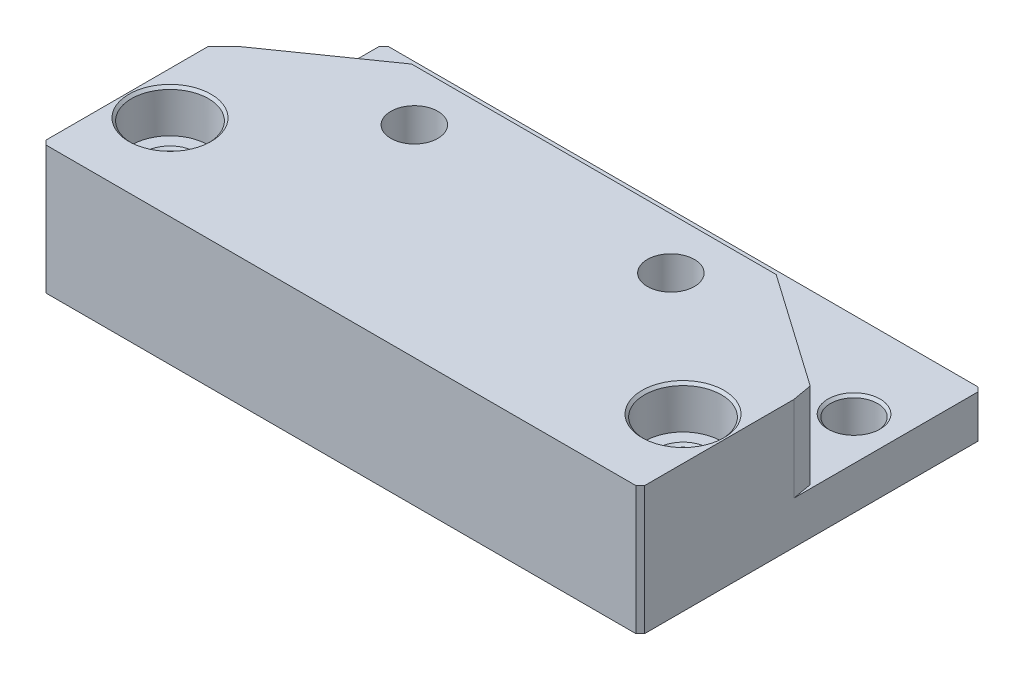
ISO-10303-21;
HEADER;
FILE_DESCRIPTION(('STEP AP214'),'2;1');
FILE_NAME('part.step','',(''),(''),'','','');
FILE_SCHEMA(('AUTOMOTIVE_DESIGN { 1 0 10303 214 1 1 1 1 }'));
ENDSEC;
DATA;
#1=APPLICATION_CONTEXT('core data for automotive mechanical design processes');
#2=APPLICATION_PROTOCOL_DEFINITION('international standard','automotive_design',2000,#1);
#3=PRODUCT_CONTEXT('',#1,'mechanical');
#4=PRODUCT('Part','Part','',(#3));
#5=PRODUCT_RELATED_PRODUCT_CATEGORY('part','',(#4));
#6=PRODUCT_DEFINITION_FORMATION('','',#4);
#7=PRODUCT_DEFINITION_CONTEXT('part definition',#1,'design');
#8=PRODUCT_DEFINITION('design','',#6,#7);
#9=PRODUCT_DEFINITION_SHAPE('','',#8);
#10=(LENGTH_UNIT() NAMED_UNIT(*) SI_UNIT(.MILLI.,.METRE.));
#11=(NAMED_UNIT(*) PLANE_ANGLE_UNIT() SI_UNIT($,.RADIAN.));
#12=(NAMED_UNIT(*) SI_UNIT($,.STERADIAN.) SOLID_ANGLE_UNIT());
#13=UNCERTAINTY_MEASURE_WITH_UNIT(LENGTH_MEASURE(1.E-05),#10,'distance_accuracy_value','');
#14=(GEOMETRIC_REPRESENTATION_CONTEXT(3) GLOBAL_UNCERTAINTY_ASSIGNED_CONTEXT((#13)) GLOBAL_UNIT_ASSIGNED_CONTEXT((#10,
#11,#12)) REPRESENTATION_CONTEXT('',''));
#15=CARTESIAN_POINT('',(0.,0.,0.));
#16=DIRECTION('',(0.,0.,1.));
#17=DIRECTION('',(1.,0.,0.));
#18=AXIS2_PLACEMENT_3D('',#15,#16,#17);
#19=CARTESIAN_POINT('',(15.,-7.5,16.42));
#20=DIRECTION('',(0.,1.,0.));
#21=DIRECTION('',(0.,0.,1.));
#22=AXIS2_PLACEMENT_3D('',#19,#20,#21);
#23=CYLINDRICAL_SURFACE('',#22,2.75);
#24=CARTESIAN_POINT('',(15.,7.5,16.42));
#25=DIRECTION('',(0.,1.,0.));
#26=DIRECTION('',(0.,0.,1.));
#27=AXIS2_PLACEMENT_3D('',#24,#25,#26);
#28=CIRCLE('',#27,2.75);
#29=CARTESIAN_POINT('',(15.,7.5,19.17));
#30=VERTEX_POINT('',#29);
#31=EDGE_CURVE('E204',#30,#30,#28,.T.);
#32=ORIENTED_EDGE('',*,*,#31,.T.);
#33=EDGE_LOOP('',(#32));
#34=FACE_BOUND('',#33,.T.);
#35=CARTESIAN_POINT('',(15.,-2.5,16.42));
#36=DIRECTION('',(0.,-1.,0.));
#37=DIRECTION('',(0.,0.,-1.));
#38=AXIS2_PLACEMENT_3D('',#35,#36,#37);
#39=CIRCLE('',#38,2.75);
#40=CARTESIAN_POINT('',(15.,-2.5,13.67));
#41=VERTEX_POINT('',#40);
#42=EDGE_CURVE('E235',#41,#41,#39,.F.);
#43=ORIENTED_EDGE('',*,*,#42,.F.);
#44=EDGE_LOOP('',(#43));
#45=FACE_BOUND('',#44,.T.);
#46=ADVANCED_FACE('F47',(#34,#45),#23,.F.);
#47=CARTESIAN_POINT('',(-15.,-7.5,16.42));
#48=DIRECTION('',(0.,1.,0.));
#49=DIRECTION('',(0.,0.,1.));
#50=AXIS2_PLACEMENT_3D('',#47,#48,#49);
#51=CYLINDRICAL_SURFACE('',#50,2.75);
#52=CARTESIAN_POINT('',(-15.,7.5,16.42));
#53=DIRECTION('',(0.,1.,0.));
#54=DIRECTION('',(0.,0.,1.));
#55=AXIS2_PLACEMENT_3D('',#52,#53,#54);
#56=CIRCLE('',#55,2.75);
#57=CARTESIAN_POINT('',(-15.,7.5,19.17));
#58=VERTEX_POINT('',#57);
#59=EDGE_CURVE('E205',#58,#58,#56,.T.);
#60=ORIENTED_EDGE('',*,*,#59,.T.);
#61=EDGE_LOOP('',(#60));
#62=FACE_BOUND('',#61,.T.);
#63=CARTESIAN_POINT('',(-15.,-2.5,16.42));
#64=DIRECTION('',(0.,-1.,0.));
#65=DIRECTION('',(0.,0.,-1.));
#66=AXIS2_PLACEMENT_3D('',#63,#64,#65);
#67=CIRCLE('',#66,2.75);
#68=CARTESIAN_POINT('',(-15.,-2.5,13.67));
#69=VERTEX_POINT('',#68);
#70=EDGE_CURVE('E232',#69,#69,#67,.F.);
#71=ORIENTED_EDGE('',*,*,#70,.F.);
#72=EDGE_LOOP('',(#71));
#73=FACE_BOUND('',#72,.T.);
#74=ADVANCED_FACE('F372',(#62,#73),#51,.F.);
#75=CARTESIAN_POINT('',(30.,-7.5,30.));
#76=DIRECTION('',(0.,1.,0.));
#77=DIRECTION('',(0.,0.,1.));
#78=AXIS2_PLACEMENT_3D('',#75,#76,#77);
#79=CYLINDRICAL_SURFACE('',#78,2.75);
#80=CARTESIAN_POINT('',(30.,2.19999999999999,30.));
#81=DIRECTION('',(0.,1.,0.));
#82=DIRECTION('',(0.,0.,1.));
#83=AXIS2_PLACEMENT_3D('',#80,#81,#82);
#84=CIRCLE('',#83,2.75);
#85=CARTESIAN_POINT('',(30.,2.19999999999999,32.75));
#86=VERTEX_POINT('',#85);
#87=EDGE_CURVE('E248',#86,#86,#84,.T.);
#88=ORIENTED_EDGE('',*,*,#87,.T.);
#89=EDGE_LOOP('',(#88));
#90=FACE_BOUND('',#89,.T.);
#91=CARTESIAN_POINT('',(30.,-7.5,30.));
#92=DIRECTION('',(0.,1.,0.));
#93=DIRECTION('',(0.,0.,-1.));
#94=AXIS2_PLACEMENT_3D('',#91,#92,#93);
#95=CIRCLE('',#94,2.75);
#96=CARTESIAN_POINT('',(30.,-7.5,27.25));
#97=VERTEX_POINT('',#96);
#98=EDGE_CURVE('E191',#97,#97,#95,.T.);
#99=ORIENTED_EDGE('',*,*,#98,.F.);
#100=EDGE_LOOP('',(#99));
#101=FACE_BOUND('',#100,.T.);
#102=ADVANCED_FACE('F379',(#90,#101),#79,.F.);
#103=CARTESIAN_POINT('',(-30.,-7.5,30.));
#104=DIRECTION('',(0.,1.,0.));
#105=DIRECTION('',(0.,0.,1.));
#106=AXIS2_PLACEMENT_3D('',#103,#104,#105);
#107=CYLINDRICAL_SURFACE('',#106,2.75);
#108=CARTESIAN_POINT('',(-30.,2.19999999999999,30.));
#109=DIRECTION('',(0.,1.,0.));
#110=DIRECTION('',(0.,0.,1.));
#111=AXIS2_PLACEMENT_3D('',#108,#109,#110);
#112=CIRCLE('',#111,2.75);
#113=CARTESIAN_POINT('',(-30.,2.19999999999999,32.75));
#114=VERTEX_POINT('',#113);
#115=EDGE_CURVE('E242',#114,#114,#112,.T.);
#116=ORIENTED_EDGE('',*,*,#115,.T.);
#117=EDGE_LOOP('',(#116));
#118=FACE_BOUND('',#117,.T.);
#119=CARTESIAN_POINT('',(-30.,-7.5,30.));
#120=DIRECTION('',(0.,1.,0.));
#121=DIRECTION('',(0.,0.,1.));
#122=AXIS2_PLACEMENT_3D('',#119,#120,#121);
#123=CIRCLE('',#122,2.75);
#124=CARTESIAN_POINT('',(-30.,-7.5,32.75));
#125=VERTEX_POINT('',#124);
#126=EDGE_CURVE('E195',#125,#125,#123,.T.);
#127=ORIENTED_EDGE('',*,*,#126,.F.);
#128=EDGE_LOOP('',(#127));
#129=FACE_BOUND('',#128,.T.);
#130=ADVANCED_FACE('F400',(#118,#129),#107,.F.);
#131=CARTESIAN_POINT('',(35.,-7.5,40.));
#132=DIRECTION('',(-1.,0.,0.));
#133=DIRECTION('',(0.,0.,1.));
#134=AXIS2_PLACEMENT_3D('',#131,#132,#133);
#135=PLANE('',#134);
#136=DIRECTION('',(0.,0.,-1.));
#137=VECTOR('',#136,1.);
#138=CARTESIAN_POINT('',(35.,7.5,40.));
#139=LINE('',#138,#137);
#140=CARTESIAN_POINT('',(35.,7.5,39.5));
#141=VERTEX_POINT('',#140);
#142=CARTESIAN_POINT('',(35.,7.5,22.0360328299639));
#143=VERTEX_POINT('',#142);
#144=EDGE_CURVE('E228',#141,#143,#139,.T.);
#145=ORIENTED_EDGE('',*,*,#144,.F.);
#146=DIRECTION('',(0.,-1.,0.));
#147=VECTOR('',#146,1.);
#148=CARTESIAN_POINT('',(35.,-7.5,39.5));
#149=LINE('',#148,#147);
#150=CARTESIAN_POINT('',(35.,-7.5,39.5));
#151=VERTEX_POINT('',#150);
#152=EDGE_CURVE('E295',#141,#151,#149,.T.);
#153=ORIENTED_EDGE('',*,*,#152,.T.);
#154=DIRECTION('',(0.,0.,-1.));
#155=VECTOR('',#154,1.);
#156=CARTESIAN_POINT('',(35.,-7.5,40.));
#157=LINE('',#156,#155);
#158=CARTESIAN_POINT('',(35.,-7.5,0.5));
#159=VERTEX_POINT('',#158);
#160=EDGE_CURVE('E217',#151,#159,#157,.T.);
#161=ORIENTED_EDGE('',*,*,#160,.T.);
#162=DIRECTION('',(0.,1.,0.));
#163=VECTOR('',#162,1.);
#164=CARTESIAN_POINT('',(35.,-2.5,0.5));
#165=LINE('',#164,#163);
#166=CARTESIAN_POINT('',(35.,-2.5,0.5));
#167=VERTEX_POINT('',#166);
#168=EDGE_CURVE('E292',#159,#167,#165,.T.);
#169=ORIENTED_EDGE('',*,*,#168,.T.);
#170=DIRECTION('',(0.,0.,-1.));
#171=VECTOR('',#170,1.);
#172=CARTESIAN_POINT('',(35.,-2.5,20.));
#173=LINE('',#172,#171);
#174=CARTESIAN_POINT('',(35.,-2.5,22.0360328299639));
#175=VERTEX_POINT('',#174);
#176=EDGE_CURVE('E178',#175,#167,#173,.T.);
#177=ORIENTED_EDGE('',*,*,#176,.F.);
#178=DIRECTION('',(0.,1.,0.));
#179=VECTOR('',#178,1.);
#180=CARTESIAN_POINT('',(35.,-7.5,22.0360328299639));
#181=LINE('',#180,#179);
#182=EDGE_CURVE('E289',#175,#143,#181,.T.);
#183=ORIENTED_EDGE('',*,*,#182,.T.);
#184=EDGE_LOOP('',(#145,#153,#161,#169,#177,#183));
#185=FACE_BOUND('',#184,.T.);
#186=ADVANCED_FACE('F343',(#185),#135,.F.);
#187=CARTESIAN_POINT('',(-35.,7.5,40.));
#188=DIRECTION('',(0.,-1.,0.));
#189=DIRECTION('',(0.,0.,-1.));
#190=AXIS2_PLACEMENT_3D('',#187,#188,#189);
#191=PLANE('',#190);
#192=CARTESIAN_POINT('',(30.,7.5,30.));
#193=DIRECTION('',(0.,-1.,0.));
#194=DIRECTION('',(0.,0.,-1.));
#195=AXIS2_PLACEMENT_3D('',#192,#193,#194);
#196=CIRCLE('',#195,4.80000000000001);
#197=CARTESIAN_POINT('',(30.,7.5,25.2));
#198=VERTEX_POINT('',#197);
#199=EDGE_CURVE('E269',#198,#198,#196,.T.);
#200=ORIENTED_EDGE('',*,*,#199,.T.);
#201=EDGE_LOOP('',(#200));
#202=FACE_BOUND('',#201,.T.);
#203=CARTESIAN_POINT('',(-30.,7.5,30.));
#204=DIRECTION('',(0.,-1.,0.));
#205=DIRECTION('',(0.,0.,-1.));
#206=AXIS2_PLACEMENT_3D('',#203,#204,#205);
#207=CIRCLE('',#206,4.80000000000001);
#208=CARTESIAN_POINT('',(-30.,7.5,25.2));
#209=VERTEX_POINT('',#208);
#210=EDGE_CURVE('E266',#209,#209,#207,.T.);
#211=ORIENTED_EDGE('',*,*,#210,.T.);
#212=EDGE_LOOP('',(#211));
#213=FACE_BOUND('',#212,.T.);
#214=ORIENTED_EDGE('',*,*,#59,.F.);
#215=EDGE_LOOP('',(#214));
#216=FACE_BOUND('',#215,.T.);
#217=ORIENTED_EDGE('',*,*,#31,.F.);
#218=EDGE_LOOP('',(#217));
#219=FACE_BOUND('',#218,.T.);
#220=DIRECTION('',(-1.,0.,0.));
#221=VECTOR('',#220,1.);
#222=CARTESIAN_POINT('',(-35.,7.5,40.));
#223=LINE('',#222,#221);
#224=CARTESIAN_POINT('',(34.5,7.5,40.));
#225=VERTEX_POINT('',#224);
#226=CARTESIAN_POINT('',(-34.5,7.5,40.));
#227=VERTEX_POINT('',#226);
#228=EDGE_CURVE('E211',#225,#227,#223,.T.);
#229=ORIENTED_EDGE('',*,*,#228,.F.);
#230=DIRECTION('',(-0.707106781186548,0.,0.707106781186548));
#231=VECTOR('',#230,1.);
#232=CARTESIAN_POINT('',(34.5,7.5,40.));
#233=LINE('',#232,#231);
#234=EDGE_CURVE('E287',#225,#141,#233,.F.);
#235=ORIENTED_EDGE('',*,*,#234,.T.);
#236=ORIENTED_EDGE('',*,*,#144,.T.);
#237=DIRECTION('',(0.173648177666937,0.,0.984807753012207));
#238=VECTOR('',#237,1.);
#239=CARTESIAN_POINT('',(35.,7.5,22.0360328299639));
#240=LINE('',#239,#238);
#241=CARTESIAN_POINT('',(34.5904239778555,7.5,19.7132117818245));
#242=VERTEX_POINT('',#241);
#243=EDGE_CURVE('E281',#143,#242,#240,.F.);
#244=ORIENTED_EDGE('',*,*,#243,.T.);
#245=DIRECTION('',(0.819152044288993,0.,0.573576436351044));
#246=VECTOR('',#245,1.);
#247=CARTESIAN_POINT('',(35.,7.5,20.));
#248=LINE('',#247,#246);
#249=CARTESIAN_POINT('',(21.3183420954105,7.5,10.42));
#250=VERTEX_POINT('',#249);
#251=EDGE_CURVE('E189',#250,#242,#248,.T.);
#252=ORIENTED_EDGE('',*,*,#251,.F.);
#253=DIRECTION('',(1.,0.,0.));
#254=VECTOR('',#253,1.);
#255=CARTESIAN_POINT('',(21.3183420954105,7.5,10.42));
#256=LINE('',#255,#254);
#257=CARTESIAN_POINT('',(-21.3183420954107,7.5,10.42));
#258=VERTEX_POINT('',#257);
#259=EDGE_CURVE('E186',#258,#250,#256,.T.);
#260=ORIENTED_EDGE('',*,*,#259,.F.);
#261=DIRECTION('',(0.819152044288989,0.,-0.57357643635105));
#262=VECTOR('',#261,1.);
#263=CARTESIAN_POINT('',(-35.,7.5,20.));
#264=LINE('',#263,#262);
#265=CARTESIAN_POINT('',(-33.3321795450956,7.5,18.8321795450956));
#266=VERTEX_POINT('',#265);
#267=EDGE_CURVE('E168',#266,#258,#264,.T.);
#268=ORIENTED_EDGE('',*,*,#267,.F.);
#269=DIRECTION('',(0.707106781186548,0.,-0.707106781186548));
#270=VECTOR('',#269,1.);
#271=CARTESIAN_POINT('',(-33.3321795450956,7.5,18.8321795450956));
#272=LINE('',#271,#270);
#273=CARTESIAN_POINT('',(-35.,7.5,20.5));
#274=VERTEX_POINT('',#273);
#275=EDGE_CURVE('E283',#266,#274,#272,.F.);
#276=ORIENTED_EDGE('',*,*,#275,.T.);
#277=DIRECTION('',(0.,0.,-1.));
#278=VECTOR('',#277,1.);
#279=CARTESIAN_POINT('',(-35.,7.5,40.));
#280=LINE('',#279,#278);
#281=CARTESIAN_POINT('',(-35.,7.5,39.5));
#282=VERTEX_POINT('',#281);
#283=EDGE_CURVE('E225',#282,#274,#280,.T.);
#284=ORIENTED_EDGE('',*,*,#283,.F.);
#285=DIRECTION('',(-0.707106781186548,0.,-0.707106781186548));
#286=VECTOR('',#285,1.);
#287=CARTESIAN_POINT('',(-34.5,7.5,40.));
#288=LINE('',#287,#286);
#289=EDGE_CURVE('E285',#282,#227,#288,.F.);
#290=ORIENTED_EDGE('',*,*,#289,.T.);
#291=EDGE_LOOP('',(#229,#235,#236,#244,#252,#260,#268,#276,#284,#290));
#292=FACE_BOUND('',#291,.T.);
#293=ADVANCED_FACE('F359',(#202,#213,#216,#219,#292),#191,.F.);
#294=CARTESIAN_POINT('',(-35.,-7.5,40.));
#295=DIRECTION('',(1.,0.,0.));
#296=DIRECTION('',(0.,0.,-1.));
#297=AXIS2_PLACEMENT_3D('',#294,#295,#296);
#298=PLANE('',#297);
#299=DIRECTION('',(0.,0.,-1.));
#300=VECTOR('',#299,1.);
#301=CARTESIAN_POINT('',(-35.,-7.5,40.));
#302=LINE('',#301,#300);
#303=CARTESIAN_POINT('',(-35.,-7.5,39.5));
#304=VERTEX_POINT('',#303);
#305=CARTESIAN_POINT('',(-35.,-7.5,0.5));
#306=VERTEX_POINT('',#305);
#307=EDGE_CURVE('E222',#304,#306,#302,.T.);
#308=ORIENTED_EDGE('',*,*,#307,.F.);
#309=DIRECTION('',(0.,1.,0.));
#310=VECTOR('',#309,1.);
#311=CARTESIAN_POINT('',(-35.,-7.5,39.5));
#312=LINE('',#311,#310);
#313=EDGE_CURVE('E311',#304,#282,#312,.T.);
#314=ORIENTED_EDGE('',*,*,#313,.T.);
#315=ORIENTED_EDGE('',*,*,#283,.T.);
#316=DIRECTION('',(0.,-1.,0.));
#317=VECTOR('',#316,1.);
#318=CARTESIAN_POINT('',(-35.,-7.5,20.5));
#319=LINE('',#318,#317);
#320=CARTESIAN_POINT('',(-35.,-2.5,20.5));
#321=VERTEX_POINT('',#320);
#322=EDGE_CURVE('E308',#274,#321,#319,.T.);
#323=ORIENTED_EDGE('',*,*,#322,.T.);
#324=DIRECTION('',(0.,0.,1.));
#325=VECTOR('',#324,1.);
#326=CARTESIAN_POINT('',(-35.,-2.5,0.));
#327=LINE('',#326,#325);
#328=CARTESIAN_POINT('',(-35.,-2.5,0.5));
#329=VERTEX_POINT('',#328);
#330=EDGE_CURVE('E162',#329,#321,#327,.T.);
#331=ORIENTED_EDGE('',*,*,#330,.F.);
#332=DIRECTION('',(0.,-1.,0.));
#333=VECTOR('',#332,1.);
#334=CARTESIAN_POINT('',(-35.,-7.5,0.5));
#335=LINE('',#334,#333);
#336=EDGE_CURVE('E305',#329,#306,#335,.T.);
#337=ORIENTED_EDGE('',*,*,#336,.T.);
#338=EDGE_LOOP('',(#308,#314,#315,#323,#331,#337));
#339=FACE_BOUND('',#338,.T.);
#340=ADVANCED_FACE('F328',(#339),#298,.F.);
#341=CARTESIAN_POINT('',(-35.,-7.5,40.));
#342=DIRECTION('',(0.,1.,0.));
#343=DIRECTION('',(0.,0.,1.));
#344=AXIS2_PLACEMENT_3D('',#341,#342,#343);
#345=PLANE('',#344);
#346=CARTESIAN_POINT('',(-15.,-7.5,16.42));
#347=DIRECTION('',(0.,-1.,0.));
#348=DIRECTION('',(0.,0.,-1.));
#349=AXIS2_PLACEMENT_3D('',#346,#347,#348);
#350=CIRCLE('',#349,4.5);
#351=CARTESIAN_POINT('',(-15.,-7.5,11.92));
#352=VERTEX_POINT('',#351);
#353=EDGE_CURVE('E736',#352,#352,#350,.T.);
#354=ORIENTED_EDGE('',*,*,#353,.F.);
#355=EDGE_LOOP('',(#354));
#356=FACE_BOUND('',#355,.T.);
#357=CARTESIAN_POINT('',(15.,-7.5,16.42));
#358=DIRECTION('',(0.,-1.,0.));
#359=DIRECTION('',(0.,0.,-1.));
#360=AXIS2_PLACEMENT_3D('',#357,#358,#359);
#361=CIRCLE('',#360,4.5);
#362=CARTESIAN_POINT('',(15.,-7.5,11.92));
#363=VERTEX_POINT('',#362);
#364=EDGE_CURVE('E734',#363,#363,#361,.T.);
#365=ORIENTED_EDGE('',*,*,#364,.F.);
#366=EDGE_LOOP('',(#365));
#367=FACE_BOUND('',#366,.T.);
#368=CARTESIAN_POINT('',(30.,-7.5,10.));
#369=DIRECTION('',(0.,1.,0.));
#370=DIRECTION('',(0.,0.,-1.));
#371=AXIS2_PLACEMENT_3D('',#368,#369,#370);
#372=CIRCLE('',#371,2.75);
#373=CARTESIAN_POINT('',(30.,-7.5,7.25));
#374=VERTEX_POINT('',#373);
#375=EDGE_CURVE('E196',#374,#374,#372,.T.);
#376=ORIENTED_EDGE('',*,*,#375,.T.);
#377=EDGE_LOOP('',(#376));
#378=FACE_BOUND('',#377,.T.);
#379=ORIENTED_EDGE('',*,*,#126,.T.);
#380=EDGE_LOOP('',(#379));
#381=FACE_BOUND('',#380,.T.);
#382=ORIENTED_EDGE('',*,*,#98,.T.);
#383=EDGE_LOOP('',(#382));
#384=FACE_BOUND('',#383,.T.);
#385=CARTESIAN_POINT('',(-30.,-7.5,10.));
#386=DIRECTION('',(0.,1.,0.));
#387=DIRECTION('',(0.,0.,1.));
#388=AXIS2_PLACEMENT_3D('',#385,#386,#387);
#389=CIRCLE('',#388,2.75);
#390=CARTESIAN_POINT('',(-30.,-7.5,12.75));
#391=VERTEX_POINT('',#390);
#392=EDGE_CURVE('E199',#391,#391,#389,.T.);
#393=ORIENTED_EDGE('',*,*,#392,.T.);
#394=EDGE_LOOP('',(#393));
#395=FACE_BOUND('',#394,.T.);
#396=ORIENTED_EDGE('',*,*,#160,.F.);
#397=DIRECTION('',(0.707106781186548,0.,-0.707106781186548));
#398=VECTOR('',#397,1.);
#399=CARTESIAN_POINT('',(34.5,-7.5,40.));
#400=LINE('',#399,#398);
#401=CARTESIAN_POINT('',(34.5,-7.5,40.));
#402=VERTEX_POINT('',#401);
#403=EDGE_CURVE('E303',#151,#402,#400,.F.);
#404=ORIENTED_EDGE('',*,*,#403,.T.);
#405=DIRECTION('',(1.,0.,0.));
#406=VECTOR('',#405,1.);
#407=CARTESIAN_POINT('',(-35.,-7.5,40.));
#408=LINE('',#407,#406);
#409=CARTESIAN_POINT('',(-34.5,-7.5,40.));
#410=VERTEX_POINT('',#409);
#411=EDGE_CURVE('E214',#410,#402,#408,.T.);
#412=ORIENTED_EDGE('',*,*,#411,.F.);
#413=DIRECTION('',(0.707106781186548,0.,0.707106781186548));
#414=VECTOR('',#413,1.);
#415=CARTESIAN_POINT('',(-34.5,-7.5,40.));
#416=LINE('',#415,#414);
#417=EDGE_CURVE('E301',#410,#304,#416,.F.);
#418=ORIENTED_EDGE('',*,*,#417,.T.);
#419=ORIENTED_EDGE('',*,*,#307,.T.);
#420=DIRECTION('',(0.707106781186548,0.,-0.707106781186548));
#421=VECTOR('',#420,1.);
#422=CARTESIAN_POINT('',(-35.,-7.5,0.5));
#423=LINE('',#422,#421);
#424=CARTESIAN_POINT('',(-34.5,-7.5,0.));
#425=VERTEX_POINT('',#424);
#426=EDGE_CURVE('E299',#306,#425,#423,.T.);
#427=ORIENTED_EDGE('',*,*,#426,.T.);
#428=DIRECTION('',(1.,0.,0.));
#429=VECTOR('',#428,1.);
#430=CARTESIAN_POINT('',(-35.,-7.5,0.));
#431=LINE('',#430,#429);
#432=CARTESIAN_POINT('',(34.5,-7.5,0.));
#433=VERTEX_POINT('',#432);
#434=EDGE_CURVE('E208',#425,#433,#431,.T.);
#435=ORIENTED_EDGE('',*,*,#434,.T.);
#436=DIRECTION('',(0.707106781186548,0.,0.707106781186548));
#437=VECTOR('',#436,1.);
#438=CARTESIAN_POINT('',(35.,-7.5,0.5));
#439=LINE('',#438,#437);
#440=EDGE_CURVE('E297',#433,#159,#439,.T.);
#441=ORIENTED_EDGE('',*,*,#440,.T.);
#442=EDGE_LOOP('',(#396,#404,#412,#418,#419,#427,#435,#441));
#443=FACE_BOUND('',#442,.T.);
#444=ADVANCED_FACE('F333',(#356,#367,#378,#381,#384,#395,#443),#345,.F.);
#445=CARTESIAN_POINT('',(0.,0.,40.));
#446=DIRECTION('',(0.,0.,-1.));
#447=DIRECTION('',(-1.,0.,0.));
#448=AXIS2_PLACEMENT_3D('',#445,#446,#447);
#449=PLANE('',#448);
#450=ORIENTED_EDGE('',*,*,#411,.T.);
#451=DIRECTION('',(0.,1.,0.));
#452=VECTOR('',#451,1.);
#453=CARTESIAN_POINT('',(34.5,0.,40.));
#454=LINE('',#453,#452);
#455=EDGE_CURVE('E278',#402,#225,#454,.T.);
#456=ORIENTED_EDGE('',*,*,#455,.T.);
#457=ORIENTED_EDGE('',*,*,#228,.T.);
#458=DIRECTION('',(0.,-1.,0.));
#459=VECTOR('',#458,1.);
#460=CARTESIAN_POINT('',(-34.5,0.,40.));
#461=LINE('',#460,#459);
#462=EDGE_CURVE('E275',#227,#410,#461,.T.);
#463=ORIENTED_EDGE('',*,*,#462,.T.);
#464=EDGE_LOOP('',(#450,#456,#457,#463));
#465=FACE_BOUND('',#464,.T.);
#466=ADVANCED_FACE('F350',(#465),#449,.F.);
#467=CARTESIAN_POINT('',(0.,0.,0.));
#468=DIRECTION('',(0.,0.,-1.));
#469=DIRECTION('',(-1.,0.,0.));
#470=AXIS2_PLACEMENT_3D('',#467,#468,#469);
#471=PLANE('',#470);
#472=ORIENTED_EDGE('',*,*,#434,.F.);
#473=DIRECTION('',(0.,1.,0.));
#474=VECTOR('',#473,1.);
#475=CARTESIAN_POINT('',(-34.5,-2.5,0.));
#476=LINE('',#475,#474);
#477=CARTESIAN_POINT('',(-34.5,-2.5,0.));
#478=VERTEX_POINT('',#477);
#479=EDGE_CURVE('E71',#425,#478,#476,.T.);
#480=ORIENTED_EDGE('',*,*,#479,.T.);
#481=DIRECTION('',(-1.,0.,0.));
#482=VECTOR('',#481,1.);
#483=CARTESIAN_POINT('',(-35.,-2.5,0.));
#484=LINE('',#483,#482);
#485=CARTESIAN_POINT('',(34.5,-2.5,0.));
#486=VERTEX_POINT('',#485);
#487=EDGE_CURVE('E173',#486,#478,#484,.T.);
#488=ORIENTED_EDGE('',*,*,#487,.F.);
#489=DIRECTION('',(0.,-1.,0.));
#490=VECTOR('',#489,1.);
#491=CARTESIAN_POINT('',(34.5,-7.5,0.));
#492=LINE('',#491,#490);
#493=EDGE_CURVE('E315',#486,#433,#492,.T.);
#494=ORIENTED_EDGE('',*,*,#493,.T.);
#495=EDGE_LOOP('',(#472,#480,#488,#494));
#496=FACE_BOUND('',#495,.T.);
#497=ADVANCED_FACE('F335',(#496),#471,.T.);
#498=CARTESIAN_POINT('',(-30.,-7.5,10.));
#499=DIRECTION('',(0.,1.,0.));
#500=DIRECTION('',(0.,0.,1.));
#501=AXIS2_PLACEMENT_3D('',#498,#499,#500);
#502=CYLINDRICAL_SURFACE('',#501,2.75);
#503=CARTESIAN_POINT('',(-30.,-2.79999999999999,10.));
#504=DIRECTION('',(0.,-1.,0.));
#505=DIRECTION('',(0.,0.,-1.));
#506=AXIS2_PLACEMENT_3D('',#503,#504,#505);
#507=CIRCLE('',#506,2.75);
#508=CARTESIAN_POINT('',(-30.,-2.79999999999999,7.25));
#509=VERTEX_POINT('',#508);
#510=EDGE_CURVE('E260',#509,#509,#507,.F.);
#511=ORIENTED_EDGE('',*,*,#510,.T.);
#512=EDGE_LOOP('',(#511));
#513=FACE_BOUND('',#512,.T.);
#514=ORIENTED_EDGE('',*,*,#392,.F.);
#515=EDGE_LOOP('',(#514));
#516=FACE_BOUND('',#515,.T.);
#517=ADVANCED_FACE('F389',(#513,#516),#502,.F.);
#518=CARTESIAN_POINT('',(30.,-7.5,10.));
#519=DIRECTION('',(0.,1.,0.));
#520=DIRECTION('',(0.,0.,1.));
#521=AXIS2_PLACEMENT_3D('',#518,#519,#520);
#522=CYLINDRICAL_SURFACE('',#521,2.75);
#523=CARTESIAN_POINT('',(30.,-2.79999999999999,10.));
#524=DIRECTION('',(0.,-1.,0.));
#525=DIRECTION('',(0.,0.,-1.));
#526=AXIS2_PLACEMENT_3D('',#523,#524,#525);
#527=CIRCLE('',#526,2.75);
#528=CARTESIAN_POINT('',(30.,-2.79999999999999,7.25));
#529=VERTEX_POINT('',#528);
#530=EDGE_CURVE('E251',#529,#529,#527,.F.);
#531=ORIENTED_EDGE('',*,*,#530,.T.);
#532=EDGE_LOOP('',(#531));
#533=FACE_BOUND('',#532,.T.);
#534=ORIENTED_EDGE('',*,*,#375,.F.);
#535=EDGE_LOOP('',(#534));
#536=FACE_BOUND('',#535,.T.);
#537=ADVANCED_FACE('F479',(#533,#536),#522,.F.);
#538=CARTESIAN_POINT('',(0.,-2.5,0.));
#539=DIRECTION('',(0.,-1.,0.));
#540=DIRECTION('',(0.,0.,-1.));
#541=AXIS2_PLACEMENT_3D('',#538,#539,#540);
#542=PLANE('',#541);
#543=CARTESIAN_POINT('',(30.,-2.5,10.));
#544=DIRECTION('',(0.,-1.,0.));
#545=DIRECTION('',(0.,0.,-1.));
#546=AXIS2_PLACEMENT_3D('',#543,#544,#545);
#547=CIRCLE('',#546,3.04999999999998);
#548=CARTESIAN_POINT('',(30.,-2.5,6.95000000000002));
#549=VERTEX_POINT('',#548);
#550=EDGE_CURVE('E257',#549,#549,#547,.T.);
#551=ORIENTED_EDGE('',*,*,#550,.T.);
#552=EDGE_LOOP('',(#551));
#553=FACE_BOUND('',#552,.T.);
#554=CARTESIAN_POINT('',(-30.,-2.5,10.));
#555=DIRECTION('',(0.,-1.,0.));
#556=DIRECTION('',(0.,0.,-1.));
#557=AXIS2_PLACEMENT_3D('',#554,#555,#556);
#558=CIRCLE('',#557,3.04999999999998);
#559=CARTESIAN_POINT('',(-30.,-2.5,6.95000000000002));
#560=VERTEX_POINT('',#559);
#561=EDGE_CURVE('E254',#560,#560,#558,.T.);
#562=ORIENTED_EDGE('',*,*,#561,.T.);
#563=EDGE_LOOP('',(#562));
#564=FACE_BOUND('',#563,.T.);
#565=ORIENTED_EDGE('',*,*,#487,.T.);
#566=DIRECTION('',(-0.707106781186548,0.,0.707106781186548));
#567=VECTOR('',#566,1.);
#568=CARTESIAN_POINT('',(-35.,-2.5,0.5));
#569=LINE('',#568,#567);
#570=EDGE_CURVE('E320',#478,#329,#569,.T.);
#571=ORIENTED_EDGE('',*,*,#570,.T.);
#572=ORIENTED_EDGE('',*,*,#330,.T.);
#573=DIRECTION('',(-0.707106781186548,0.,0.707106781186548));
#574=VECTOR('',#573,1.);
#575=CARTESIAN_POINT('',(-7.25000000000001,-2.5,-7.25000000000001));
#576=LINE('',#575,#574);
#577=CARTESIAN_POINT('',(-33.3321795450956,-2.5,18.8321795450956));
#578=VERTEX_POINT('',#577);
#579=EDGE_CURVE('E56',#321,#578,#576,.F.);
#580=ORIENTED_EDGE('',*,*,#579,.T.);
#581=DIRECTION('',(0.819152044288989,0.,-0.57357643635105));
#582=VECTOR('',#581,1.);
#583=CARTESIAN_POINT('',(-35.,-2.5,20.));
#584=LINE('',#583,#582);
#585=CARTESIAN_POINT('',(-21.3183420954107,-2.5,10.42));
#586=VERTEX_POINT('',#585);
#587=EDGE_CURVE('E153',#578,#586,#584,.T.);
#588=ORIENTED_EDGE('',*,*,#587,.T.);
#589=DIRECTION('',(1.,0.,0.));
#590=VECTOR('',#589,1.);
#591=CARTESIAN_POINT('',(21.3183420954105,-2.5,10.42));
#592=LINE('',#591,#590);
#593=CARTESIAN_POINT('',(21.3183420954105,-2.5,10.42));
#594=VERTEX_POINT('',#593);
#595=EDGE_CURVE('E157',#586,#594,#592,.T.);
#596=ORIENTED_EDGE('',*,*,#595,.T.);
#597=DIRECTION('',(0.819152044288993,0.,0.573576436351044));
#598=VECTOR('',#597,1.);
#599=CARTESIAN_POINT('',(35.,-2.5,20.));
#600=LINE('',#599,#598);
#601=CARTESIAN_POINT('',(34.5904239778555,-2.5,19.7132117818245));
#602=VERTEX_POINT('',#601);
#603=EDGE_CURVE('E176',#594,#602,#600,.T.);
#604=ORIENTED_EDGE('',*,*,#603,.T.);
#605=DIRECTION('',(-0.173648177666937,0.,-0.984807753012207));
#606=VECTOR('',#605,1.);
#607=CARTESIAN_POINT('',(30.1762373103365,-2.5,-5.32088481407396));
#608=LINE('',#607,#606);
#609=EDGE_CURVE('E11',#602,#175,#608,.F.);
#610=ORIENTED_EDGE('',*,*,#609,.T.);
#611=ORIENTED_EDGE('',*,*,#176,.T.);
#612=DIRECTION('',(-0.707106781186548,0.,-0.707106781186548));
#613=VECTOR('',#612,1.);
#614=CARTESIAN_POINT('',(35.,-2.5,0.5));
#615=LINE('',#614,#613);
#616=EDGE_CURVE('E318',#167,#486,#615,.T.);
#617=ORIENTED_EDGE('',*,*,#616,.T.);
#618=EDGE_LOOP('',(#565,#571,#572,#580,#588,#596,#604,#610,#611,#617));
#619=FACE_BOUND('',#618,.T.);
#620=ADVANCED_FACE('F155',(#553,#564,#619),#542,.F.);
#621=CARTESIAN_POINT('',(35.,-2.5,20.));
#622=DIRECTION('',(-0.573576436351044,0.,0.819152044288993));
#623=DIRECTION('',(0.819152044288994,0.,0.573576436351044));
#624=AXIS2_PLACEMENT_3D('',#621,#622,#623);
#625=PLANE('',#624);
#626=ORIENTED_EDGE('',*,*,#251,.T.);
#627=DIRECTION('',(0.,-1.,0.));
#628=VECTOR('',#627,1.);
#629=CARTESIAN_POINT('',(34.5904239778555,-2.5,19.7132117818245));
#630=LINE('',#629,#628);
#631=EDGE_CURVE('E63',#242,#602,#630,.T.);
#632=ORIENTED_EDGE('',*,*,#631,.T.);
#633=ORIENTED_EDGE('',*,*,#603,.F.);
#634=DIRECTION('',(0.,1.,0.));
#635=VECTOR('',#634,1.);
#636=CARTESIAN_POINT('',(21.3183420954105,-2.5,10.42));
#637=LINE('',#636,#635);
#638=EDGE_CURVE('E172',#594,#250,#637,.T.);
#639=ORIENTED_EDGE('',*,*,#638,.T.);
#640=EDGE_LOOP('',(#626,#632,#633,#639));
#641=FACE_BOUND('',#640,.T.);
#642=ADVANCED_FACE('F470',(#641),#625,.F.);
#643=CARTESIAN_POINT('',(21.3183420954105,-2.5,10.42));
#644=DIRECTION('',(0.,0.,1.));
#645=DIRECTION('',(1.,0.,0.));
#646=AXIS2_PLACEMENT_3D('',#643,#644,#645);
#647=PLANE('',#646);
#648=ORIENTED_EDGE('',*,*,#259,.T.);
#649=ORIENTED_EDGE('',*,*,#638,.F.);
#650=ORIENTED_EDGE('',*,*,#595,.F.);
#651=DIRECTION('',(0.,1.,0.));
#652=VECTOR('',#651,1.);
#653=CARTESIAN_POINT('',(-21.3183420954107,-2.5,10.42));
#654=LINE('',#653,#652);
#655=EDGE_CURVE('E165',#586,#258,#654,.T.);
#656=ORIENTED_EDGE('',*,*,#655,.T.);
#657=EDGE_LOOP('',(#648,#649,#650,#656));
#658=FACE_BOUND('',#657,.T.);
#659=ADVANCED_FACE('F175',(#658),#647,.F.);
#660=CARTESIAN_POINT('',(-35.,-2.5,20.));
#661=DIRECTION('',(0.57357643635105,0.,0.819152044288989));
#662=DIRECTION('',(0.819152044288989,0.,-0.57357643635105));
#663=AXIS2_PLACEMENT_3D('',#660,#661,#662);
#664=PLANE('',#663);
#665=ORIENTED_EDGE('',*,*,#587,.F.);
#666=DIRECTION('',(0.,1.,0.));
#667=VECTOR('',#666,1.);
#668=CARTESIAN_POINT('',(-33.3321795450956,-2.5,18.8321795450956));
#669=LINE('',#668,#667);
#670=EDGE_CURVE('E313',#578,#266,#669,.T.);
#671=ORIENTED_EDGE('',*,*,#670,.T.);
#672=ORIENTED_EDGE('',*,*,#267,.T.);
#673=ORIENTED_EDGE('',*,*,#655,.F.);
#674=EDGE_LOOP('',(#665,#671,#672,#673));
#675=FACE_BOUND('',#674,.T.);
#676=ADVANCED_FACE('F166',(#675),#664,.F.);
#677=CARTESIAN_POINT('',(-30.,2.5,30.));
#678=DIRECTION('',(0.,1.,0.));
#679=DIRECTION('',(0.,0.,1.));
#680=AXIS2_PLACEMENT_3D('',#677,#678,#679);
#681=PLANE('',#680);
#682=CARTESIAN_POINT('',(-30.,2.5,30.));
#683=DIRECTION('',(0.,1.,0.));
#684=DIRECTION('',(0.,0.,1.));
#685=AXIS2_PLACEMENT_3D('',#682,#683,#684);
#686=CIRCLE('',#685,3.05);
#687=CARTESIAN_POINT('',(-30.,2.5,33.05));
#688=VERTEX_POINT('',#687);
#689=EDGE_CURVE('E231',#688,#688,#686,.F.);
#690=ORIENTED_EDGE('',*,*,#689,.T.);
#691=EDGE_LOOP('',(#690));
#692=FACE_BOUND('',#691,.T.);
#693=CARTESIAN_POINT('',(-30.,2.5,30.));
#694=DIRECTION('',(0.,1.,0.));
#695=DIRECTION('',(0.,0.,1.));
#696=AXIS2_PLACEMENT_3D('',#693,#694,#695);
#697=CIRCLE('',#696,4.5);
#698=CARTESIAN_POINT('',(-30.,2.5,34.5));
#699=VERTEX_POINT('',#698);
#700=EDGE_CURVE('E187',#699,#699,#697,.T.);
#701=ORIENTED_EDGE('',*,*,#700,.T.);
#702=EDGE_LOOP('',(#701));
#703=FACE_BOUND('',#702,.T.);
#704=ADVANCED_FACE('F485',(#692,#703),#681,.T.);
#705=CARTESIAN_POINT('',(-30.,2.5,30.));
#706=DIRECTION('',(0.,1.,0.));
#707=DIRECTION('',(0.,0.,1.));
#708=AXIS2_PLACEMENT_3D('',#705,#706,#707);
#709=CYLINDRICAL_SURFACE('',#708,4.5);
#710=CARTESIAN_POINT('',(-30.,7.2,30.));
#711=DIRECTION('',(0.,-1.,0.));
#712=DIRECTION('',(0.,0.,-1.));
#713=AXIS2_PLACEMENT_3D('',#710,#711,#712);
#714=CIRCLE('',#713,4.5);
#715=CARTESIAN_POINT('',(-30.,7.2,25.5));
#716=VERTEX_POINT('',#715);
#717=EDGE_CURVE('E272',#716,#716,#714,.F.);
#718=ORIENTED_EDGE('',*,*,#717,.T.);
#719=EDGE_LOOP('',(#718));
#720=FACE_BOUND('',#719,.T.);
#721=ORIENTED_EDGE('',*,*,#700,.F.);
#722=EDGE_LOOP('',(#721));
#723=FACE_BOUND('',#722,.T.);
#724=ADVANCED_FACE('F519',(#720,#723),#709,.F.);
#725=CARTESIAN_POINT('',(30.,2.5,30.));
#726=DIRECTION('',(0.,1.,0.));
#727=DIRECTION('',(0.,0.,1.));
#728=AXIS2_PLACEMENT_3D('',#725,#726,#727);
#729=PLANE('',#728);
#730=CARTESIAN_POINT('',(30.,2.5,30.));
#731=DIRECTION('',(0.,1.,0.));
#732=DIRECTION('',(0.,0.,1.));
#733=AXIS2_PLACEMENT_3D('',#730,#731,#732);
#734=CIRCLE('',#733,3.05);
#735=CARTESIAN_POINT('',(30.,2.5,33.05));
#736=VERTEX_POINT('',#735);
#737=EDGE_CURVE('E245',#736,#736,#734,.F.);
#738=ORIENTED_EDGE('',*,*,#737,.T.);
#739=EDGE_LOOP('',(#738));
#740=FACE_BOUND('',#739,.T.);
#741=CARTESIAN_POINT('',(30.,2.5,30.));
#742=DIRECTION('',(0.,1.,0.));
#743=DIRECTION('',(0.,0.,1.));
#744=AXIS2_PLACEMENT_3D('',#741,#742,#743);
#745=CIRCLE('',#744,4.5);
#746=CARTESIAN_POINT('',(30.,2.5,34.5));
#747=VERTEX_POINT('',#746);
#748=EDGE_CURVE('E239',#747,#747,#745,.T.);
#749=ORIENTED_EDGE('',*,*,#748,.T.);
#750=EDGE_LOOP('',(#749));
#751=FACE_BOUND('',#750,.T.);
#752=ADVANCED_FACE('F527',(#740,#751),#729,.T.);
#753=CARTESIAN_POINT('',(30.,2.5,30.));
#754=DIRECTION('',(0.,1.,0.));
#755=DIRECTION('',(0.,0.,1.));
#756=AXIS2_PLACEMENT_3D('',#753,#754,#755);
#757=CYLINDRICAL_SURFACE('',#756,4.5);
#758=CARTESIAN_POINT('',(30.,7.2,30.));
#759=DIRECTION('',(0.,-1.,0.));
#760=DIRECTION('',(0.,0.,-1.));
#761=AXIS2_PLACEMENT_3D('',#758,#759,#760);
#762=CIRCLE('',#761,4.5);
#763=CARTESIAN_POINT('',(30.,7.2,25.5));
#764=VERTEX_POINT('',#763);
#765=EDGE_CURVE('E263',#764,#764,#762,.F.);
#766=ORIENTED_EDGE('',*,*,#765,.T.);
#767=EDGE_LOOP('',(#766));
#768=FACE_BOUND('',#767,.T.);
#769=ORIENTED_EDGE('',*,*,#748,.F.);
#770=EDGE_LOOP('',(#769));
#771=FACE_BOUND('',#770,.T.);
#772=ADVANCED_FACE('F530',(#768,#771),#757,.F.);
#773=CARTESIAN_POINT('',(-15.,-2.5,16.42));
#774=DIRECTION('',(0.,-1.,0.));
#775=DIRECTION('',(0.,0.,-1.));
#776=AXIS2_PLACEMENT_3D('',#773,#774,#775);
#777=PLANE('',#776);
#778=CARTESIAN_POINT('',(-15.,-2.5,16.42));
#779=DIRECTION('',(0.,-1.,0.));
#780=DIRECTION('',(0.,0.,-1.));
#781=AXIS2_PLACEMENT_3D('',#778,#779,#780);
#782=CIRCLE('',#781,4.5);
#783=CARTESIAN_POINT('',(-15.,-2.5,11.92));
#784=VERTEX_POINT('',#783);
#785=EDGE_CURVE('E236',#784,#784,#782,.T.);
#786=ORIENTED_EDGE('',*,*,#785,.T.);
#787=EDGE_LOOP('',(#786));
#788=FACE_BOUND('',#787,.T.);
#789=ORIENTED_EDGE('',*,*,#70,.T.);
#790=EDGE_LOOP('',(#789));
#791=FACE_BOUND('',#790,.T.);
#792=ADVANCED_FACE('F567',(#788,#791),#777,.T.);
#793=CARTESIAN_POINT('',(-15.,-2.5,16.42));
#794=DIRECTION('',(0.,-1.,0.));
#795=DIRECTION('',(0.,0.,-1.));
#796=AXIS2_PLACEMENT_3D('',#793,#794,#795);
#797=CYLINDRICAL_SURFACE('',#796,4.5);
#798=ORIENTED_EDGE('',*,*,#785,.F.);
#799=EDGE_LOOP('',(#798));
#800=FACE_BOUND('',#799,.T.);
#801=ORIENTED_EDGE('',*,*,#353,.T.);
#802=EDGE_LOOP('',(#801));
#803=FACE_BOUND('',#802,.T.);
#804=ADVANCED_FACE('F662',(#800,#803),#797,.F.);
#805=CARTESIAN_POINT('',(15.,-2.5,16.42));
#806=DIRECTION('',(0.,-1.,0.));
#807=DIRECTION('',(0.,0.,-1.));
#808=AXIS2_PLACEMENT_3D('',#805,#806,#807);
#809=PLANE('',#808);
#810=CARTESIAN_POINT('',(15.,-2.5,16.42));
#811=DIRECTION('',(0.,-1.,0.));
#812=DIRECTION('',(0.,0.,-1.));
#813=AXIS2_PLACEMENT_3D('',#810,#811,#812);
#814=CIRCLE('',#813,4.5);
#815=CARTESIAN_POINT('',(15.,-2.5,11.92));
#816=VERTEX_POINT('',#815);
#817=EDGE_CURVE('E731',#816,#816,#814,.T.);
#818=ORIENTED_EDGE('',*,*,#817,.T.);
#819=EDGE_LOOP('',(#818));
#820=FACE_BOUND('',#819,.T.);
#821=ORIENTED_EDGE('',*,*,#42,.T.);
#822=EDGE_LOOP('',(#821));
#823=FACE_BOUND('',#822,.T.);
#824=ADVANCED_FACE('F671',(#820,#823),#809,.T.);
#825=CARTESIAN_POINT('',(15.,-2.5,16.42));
#826=DIRECTION('',(0.,-1.,0.));
#827=DIRECTION('',(0.,0.,-1.));
#828=AXIS2_PLACEMENT_3D('',#825,#826,#827);
#829=CYLINDRICAL_SURFACE('',#828,4.5);
#830=ORIENTED_EDGE('',*,*,#817,.F.);
#831=EDGE_LOOP('',(#830));
#832=FACE_BOUND('',#831,.T.);
#833=ORIENTED_EDGE('',*,*,#364,.T.);
#834=EDGE_LOOP('',(#833));
#835=FACE_BOUND('',#834,.T.);
#836=ADVANCED_FACE('F409',(#832,#835),#829,.F.);
#837=CARTESIAN_POINT('',(-30.,2.5,30.));
#838=DIRECTION('',(0.,1.,0.));
#839=DIRECTION('',(0.,0.,1.));
#840=AXIS2_PLACEMENT_3D('',#837,#838,#839);
#841=CONICAL_SURFACE('',#840,3.05,0.785398163397445);
#842=ORIENTED_EDGE('',*,*,#115,.F.);
#843=EDGE_LOOP('',(#842));
#844=FACE_BOUND('',#843,.T.);
#845=ORIENTED_EDGE('',*,*,#689,.F.);
#846=EDGE_LOOP('',(#845));
#847=FACE_BOUND('',#846,.T.);
#848=ADVANCED_FACE('F402',(#844,#847),#841,.F.);
#849=CARTESIAN_POINT('',(30.,2.5,30.));
#850=DIRECTION('',(0.,1.,0.));
#851=DIRECTION('',(0.,0.,1.));
#852=AXIS2_PLACEMENT_3D('',#849,#850,#851);
#853=CONICAL_SURFACE('',#852,3.05,0.785398163397445);
#854=ORIENTED_EDGE('',*,*,#87,.F.);
#855=EDGE_LOOP('',(#854));
#856=FACE_BOUND('',#855,.T.);
#857=ORIENTED_EDGE('',*,*,#737,.F.);
#858=EDGE_LOOP('',(#857));
#859=FACE_BOUND('',#858,.T.);
#860=ADVANCED_FACE('F408',(#856,#859),#853,.F.);
#861=CARTESIAN_POINT('',(30.,-2.79999999999999,10.));
#862=DIRECTION('',(0.,1.,0.));
#863=DIRECTION('',(0.,0.,1.));
#864=AXIS2_PLACEMENT_3D('',#861,#862,#863);
#865=CONICAL_SURFACE('',#864,2.75,0.785398163397435);
#866=ORIENTED_EDGE('',*,*,#550,.F.);
#867=EDGE_LOOP('',(#866));
#868=FACE_BOUND('',#867,.T.);
#869=ORIENTED_EDGE('',*,*,#530,.F.);
#870=EDGE_LOOP('',(#869));
#871=FACE_BOUND('',#870,.T.);
#872=ADVANCED_FACE('F416',(#868,#871),#865,.F.);
#873=CARTESIAN_POINT('',(-30.,-2.79999999999999,10.));
#874=DIRECTION('',(0.,1.,0.));
#875=DIRECTION('',(0.,0.,1.));
#876=AXIS2_PLACEMENT_3D('',#873,#874,#875);
#877=CONICAL_SURFACE('',#876,2.75,0.785398163397435);
#878=ORIENTED_EDGE('',*,*,#561,.F.);
#879=EDGE_LOOP('',(#878));
#880=FACE_BOUND('',#879,.T.);
#881=ORIENTED_EDGE('',*,*,#510,.F.);
#882=EDGE_LOOP('',(#881));
#883=FACE_BOUND('',#882,.T.);
#884=ADVANCED_FACE('F423',(#880,#883),#877,.F.);
#885=CARTESIAN_POINT('',(30.,7.2,30.));
#886=DIRECTION('',(0.,1.,0.));
#887=DIRECTION('',(0.,0.,1.));
#888=AXIS2_PLACEMENT_3D('',#885,#886,#887);
#889=CONICAL_SURFACE('',#888,4.5,0.785398163397455);
#890=ORIENTED_EDGE('',*,*,#199,.F.);
#891=EDGE_LOOP('',(#890));
#892=FACE_BOUND('',#891,.T.);
#893=ORIENTED_EDGE('',*,*,#765,.F.);
#894=EDGE_LOOP('',(#893));
#895=FACE_BOUND('',#894,.T.);
#896=ADVANCED_FACE('F430',(#892,#895),#889,.F.);
#897=CARTESIAN_POINT('',(-30.,7.2,30.));
#898=DIRECTION('',(0.,1.,0.));
#899=DIRECTION('',(0.,0.,1.));
#900=AXIS2_PLACEMENT_3D('',#897,#898,#899);
#901=CONICAL_SURFACE('',#900,4.5,0.785398163397455);
#902=ORIENTED_EDGE('',*,*,#210,.F.);
#903=EDGE_LOOP('',(#902));
#904=FACE_BOUND('',#903,.T.);
#905=ORIENTED_EDGE('',*,*,#717,.F.);
#906=EDGE_LOOP('',(#905));
#907=FACE_BOUND('',#906,.T.);
#908=ADVANCED_FACE('F437',(#904,#907),#901,.F.);
#909=CARTESIAN_POINT('',(34.5,0.,40.));
#910=DIRECTION('',(-0.707106781186547,0.,-0.707106781186547));
#911=DIRECTION('',(0.,1.,0.));
#912=AXIS2_PLACEMENT_3D('',#909,#910,#911);
#913=PLANE('',#912);
#914=ORIENTED_EDGE('',*,*,#403,.F.);
#915=ORIENTED_EDGE('',*,*,#152,.F.);
#916=ORIENTED_EDGE('',*,*,#234,.F.);
#917=ORIENTED_EDGE('',*,*,#455,.F.);
#918=EDGE_LOOP('',(#914,#915,#916,#917));
#919=FACE_BOUND('',#918,.T.);
#920=ADVANCED_FACE('F346',(#919),#913,.F.);
#921=CARTESIAN_POINT('',(-34.5,0.,40.));
#922=DIRECTION('',(0.707106781186547,0.,-0.707106781186547));
#923=DIRECTION('',(0.,-1.,0.));
#924=AXIS2_PLACEMENT_3D('',#921,#922,#923);
#925=PLANE('',#924);
#926=ORIENTED_EDGE('',*,*,#289,.F.);
#927=ORIENTED_EDGE('',*,*,#313,.F.);
#928=ORIENTED_EDGE('',*,*,#417,.F.);
#929=ORIENTED_EDGE('',*,*,#462,.F.);
#930=EDGE_LOOP('',(#926,#927,#928,#929));
#931=FACE_BOUND('',#930,.T.);
#932=ADVANCED_FACE('F355',(#931),#925,.F.);
#933=CARTESIAN_POINT('',(-33.3321795450956,-2.5,18.8321795450956));
#934=DIRECTION('',(0.707106781186548,0.,0.707106781186548));
#935=DIRECTION('',(0.,1.,0.));
#936=AXIS2_PLACEMENT_3D('',#933,#934,#935);
#937=PLANE('',#936);
#938=ORIENTED_EDGE('',*,*,#579,.F.);
#939=ORIENTED_EDGE('',*,*,#322,.F.);
#940=ORIENTED_EDGE('',*,*,#275,.F.);
#941=ORIENTED_EDGE('',*,*,#670,.F.);
#942=EDGE_LOOP('',(#938,#939,#940,#941));
#943=FACE_BOUND('',#942,.T.);
#944=ADVANCED_FACE('F361',(#943),#937,.F.);
#945=CARTESIAN_POINT('',(-35.,-7.5,0.5));
#946=DIRECTION('',(-0.707106781186547,0.,-0.707106781186547));
#947=DIRECTION('',(0.,1.,0.));
#948=AXIS2_PLACEMENT_3D('',#945,#946,#947);
#949=PLANE('',#948);
#950=ORIENTED_EDGE('',*,*,#570,.F.);
#951=ORIENTED_EDGE('',*,*,#479,.F.);
#952=ORIENTED_EDGE('',*,*,#426,.F.);
#953=ORIENTED_EDGE('',*,*,#336,.F.);
#954=EDGE_LOOP('',(#950,#951,#952,#953));
#955=FACE_BOUND('',#954,.T.);
#956=ADVANCED_FACE('F330',(#955),#949,.T.);
#957=CARTESIAN_POINT('',(35.,-7.5,0.5));
#958=DIRECTION('',(0.707106781186547,0.,-0.707106781186547));
#959=DIRECTION('',(0.,-1.,0.));
#960=AXIS2_PLACEMENT_3D('',#957,#958,#959);
#961=PLANE('',#960);
#962=ORIENTED_EDGE('',*,*,#440,.F.);
#963=ORIENTED_EDGE('',*,*,#493,.F.);
#964=ORIENTED_EDGE('',*,*,#616,.F.);
#965=ORIENTED_EDGE('',*,*,#168,.F.);
#966=EDGE_LOOP('',(#962,#963,#964,#965));
#967=FACE_BOUND('',#966,.T.);
#968=ADVANCED_FACE('F338',(#967),#961,.T.);
#969=CARTESIAN_POINT('',(35.,-7.5,22.0360328299639));
#970=DIRECTION('',(-0.984807753012207,0.,0.173648177666937));
#971=DIRECTION('',(0.,1.,0.));
#972=AXIS2_PLACEMENT_3D('',#969,#970,#971);
#973=PLANE('',#972);
#974=ORIENTED_EDGE('',*,*,#609,.F.);
#975=ORIENTED_EDGE('',*,*,#631,.F.);
#976=ORIENTED_EDGE('',*,*,#243,.F.);
#977=ORIENTED_EDGE('',*,*,#182,.F.);
#978=EDGE_LOOP('',(#974,#975,#976,#977));
#979=FACE_BOUND('',#978,.T.);
#980=ADVANCED_FACE('F50',(#979),#973,.F.);
#981=CLOSED_SHELL('',(#46,#74,#102,#130,#186,#293,#340,#444,#466,#497,#517,#537,#620,#642,#659,
#676,#704,#724,#752,#772,#792,#804,#824,#836,#848,#860,#872,#884,#896,#908,#920,#932,#944,#956,
#968,#980));
#982=MANIFOLD_SOLID_BREP('B2',#981);
#983=ADVANCED_BREP_SHAPE_REPRESENTATION('',(#18,#982),#14);
#984=SHAPE_DEFINITION_REPRESENTATION(#9,#983);
ENDSEC;
END-ISO-10303-21;
